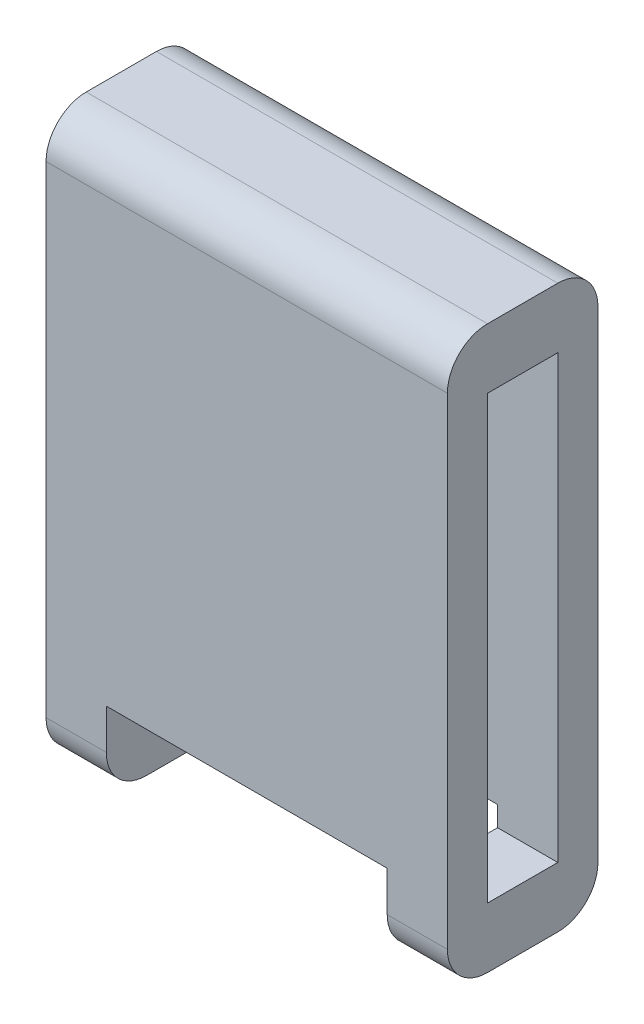
ISO-10303-21;
HEADER;
FILE_DESCRIPTION(('STEP AP214'),'2;1');
FILE_NAME('part.step','',(''),(''),'','','');
FILE_SCHEMA(('AUTOMOTIVE_DESIGN { 1 0 10303 214 1 1 1 1 }'));
ENDSEC;
DATA;
#1=APPLICATION_CONTEXT('core data for automotive mechanical design processes');
#2=APPLICATION_PROTOCOL_DEFINITION('international standard','automotive_design',2000,#1);
#3=PRODUCT_CONTEXT('',#1,'mechanical');
#4=PRODUCT('Part','Part','',(#3));
#5=PRODUCT_RELATED_PRODUCT_CATEGORY('part','',(#4));
#6=PRODUCT_DEFINITION_FORMATION('','',#4);
#7=PRODUCT_DEFINITION_CONTEXT('part definition',#1,'design');
#8=PRODUCT_DEFINITION('design','',#6,#7);
#9=PRODUCT_DEFINITION_SHAPE('','',#8);
#10=(LENGTH_UNIT() NAMED_UNIT(*) SI_UNIT(.MILLI.,.METRE.));
#11=(NAMED_UNIT(*) PLANE_ANGLE_UNIT() SI_UNIT($,.RADIAN.));
#12=(NAMED_UNIT(*) SI_UNIT($,.STERADIAN.) SOLID_ANGLE_UNIT());
#13=UNCERTAINTY_MEASURE_WITH_UNIT(LENGTH_MEASURE(1.E-05),#10,'distance_accuracy_value','');
#14=(GEOMETRIC_REPRESENTATION_CONTEXT(3) GLOBAL_UNCERTAINTY_ASSIGNED_CONTEXT((#13)) GLOBAL_UNIT_ASSIGNED_CONTEXT((#10,
#11,#12)) REPRESENTATION_CONTEXT('',''));
#15=CARTESIAN_POINT('',(0.,0.,0.));
#16=DIRECTION('',(0.,0.,1.));
#17=DIRECTION('',(1.,0.,0.));
#18=AXIS2_PLACEMENT_3D('',#15,#16,#17);
#19=CARTESIAN_POINT('',(-10.,-14.,-15.2547920021456));
#20=DIRECTION('',(0.,1.,0.));
#21=DIRECTION('',(-1.,0.,0.));
#22=AXIS2_PLACEMENT_3D('',#19,#20,#21);
#23=PLANE('',#22);
#24=DIRECTION('',(-1.,0.,0.));
#25=VECTOR('',#24,1.);
#26=CARTESIAN_POINT('',(10.,-14.,-13.2547920021456));
#27=LINE('',#26,#25);
#28=CARTESIAN_POINT('',(-10.,-14.,-13.2547920021456));
#29=VERTEX_POINT('',#28);
#30=CARTESIAN_POINT('',(-7.,-14.,-13.2547920021456));
#31=VERTEX_POINT('',#30);
#32=EDGE_CURVE('E313',#29,#31,#27,.F.);
#33=ORIENTED_EDGE('',*,*,#32,.T.);
#34=DIRECTION('',(0.,0.,1.));
#35=VECTOR('',#34,1.);
#36=CARTESIAN_POINT('',(-7.,-14.,-17.7547920021456));
#37=LINE('',#36,#35);
#38=CARTESIAN_POINT('',(-7.,-14.,-9.75479200214557));
#39=VERTEX_POINT('',#38);
#40=EDGE_CURVE('E203',#31,#39,#37,.T.);
#41=ORIENTED_EDGE('',*,*,#40,.T.);
#42=DIRECTION('',(-1.,0.,0.));
#43=VECTOR('',#42,1.);
#44=CARTESIAN_POINT('',(-10.,-14.,-9.75479200214557));
#45=LINE('',#44,#43);
#46=CARTESIAN_POINT('',(-10.,-14.,-9.75479200214557));
#47=VERTEX_POINT('',#46);
#48=EDGE_CURVE('E308',#39,#47,#45,.T.);
#49=ORIENTED_EDGE('',*,*,#48,.T.);
#50=DIRECTION('',(0.,0.,1.));
#51=VECTOR('',#50,1.);
#52=CARTESIAN_POINT('',(-10.,-14.,-15.2547920021456));
#53=LINE('',#52,#51);
#54=EDGE_CURVE('E275',#29,#47,#53,.T.);
#55=ORIENTED_EDGE('',*,*,#54,.F.);
#56=EDGE_LOOP('',(#33,#41,#49,#55));
#57=FACE_BOUND('',#56,.T.);
#58=ADVANCED_FACE('F33',(#57),#23,.F.);
#59=CARTESIAN_POINT('',(0.,-12.,-13.2547920021456));
#60=DIRECTION('',(1.,0.,0.));
#61=DIRECTION('',(0.,1.,0.));
#62=AXIS2_PLACEMENT_3D('',#59,#60,#61);
#63=CYLINDRICAL_SURFACE('',#62,2.);
#64=CARTESIAN_POINT('',(-7.,-12.,-13.2547920021456));
#65=DIRECTION('',(-1.,0.,0.));
#66=DIRECTION('',(0.,-1.,0.));
#67=AXIS2_PLACEMENT_3D('',#64,#65,#66);
#68=CIRCLE('',#67,2.);
#69=CARTESIAN_POINT('',(-7.,-12.,-15.2547920021456));
#70=VERTEX_POINT('',#69);
#71=EDGE_CURVE('E232',#31,#70,#68,.F.);
#72=ORIENTED_EDGE('',*,*,#71,.F.);
#73=ORIENTED_EDGE('',*,*,#32,.F.);
#74=CARTESIAN_POINT('',(-10.,-12.,-13.2547920021456));
#75=DIRECTION('',(1.,0.,0.));
#76=DIRECTION('',(0.,0.,-1.));
#77=AXIS2_PLACEMENT_3D('',#74,#75,#76);
#78=CIRCLE('',#77,2.);
#79=CARTESIAN_POINT('',(-10.,-12.,-15.2547920021456));
#80=VERTEX_POINT('',#79);
#81=EDGE_CURVE('E306',#80,#29,#78,.F.);
#82=ORIENTED_EDGE('',*,*,#81,.F.);
#83=DIRECTION('',(-1.,0.,0.));
#84=VECTOR('',#83,1.);
#85=CARTESIAN_POINT('',(-10.,-12.,-15.2547920021456));
#86=LINE('',#85,#84);
#87=EDGE_CURVE('E295',#70,#80,#86,.T.);
#88=ORIENTED_EDGE('',*,*,#87,.F.);
#89=EDGE_LOOP('',(#72,#73,#82,#88));
#90=FACE_BOUND('',#89,.T.);
#91=ADVANCED_FACE('F359',(#90),#63,.T.);
#92=CARTESIAN_POINT('',(-10.,-12.,-9.75479200214557));
#93=DIRECTION('',(-1.,0.,0.));
#94=DIRECTION('',(0.,-1.,0.));
#95=AXIS2_PLACEMENT_3D('',#92,#93,#94);
#96=CYLINDRICAL_SURFACE('',#95,2.);
#97=CARTESIAN_POINT('',(-7.,-12.,-9.75479200214557));
#98=DIRECTION('',(-1.,0.,0.));
#99=DIRECTION('',(0.,-1.,0.));
#100=AXIS2_PLACEMENT_3D('',#97,#98,#99);
#101=CIRCLE('',#100,2.);
#102=CARTESIAN_POINT('',(-7.,-12.,-7.75479200214557));
#103=VERTEX_POINT('',#102);
#104=EDGE_CURVE('E230',#103,#39,#101,.F.);
#105=ORIENTED_EDGE('',*,*,#104,.F.);
#106=DIRECTION('',(-1.,0.,0.));
#107=VECTOR('',#106,1.);
#108=CARTESIAN_POINT('',(0.,-12.,-7.75479200214557));
#109=LINE('',#108,#107);
#110=CARTESIAN_POINT('',(-10.,-12.,-7.75479200214557));
#111=VERTEX_POINT('',#110);
#112=EDGE_CURVE('E334',#111,#103,#109,.F.);
#113=ORIENTED_EDGE('',*,*,#112,.F.);
#114=CARTESIAN_POINT('',(-10.,-12.,-9.75479200214557));
#115=DIRECTION('',(1.,0.,0.));
#116=DIRECTION('',(0.,0.,-1.));
#117=AXIS2_PLACEMENT_3D('',#114,#115,#116);
#118=CIRCLE('',#117,2.);
#119=EDGE_CURVE('E299',#47,#111,#118,.F.);
#120=ORIENTED_EDGE('',*,*,#119,.F.);
#121=ORIENTED_EDGE('',*,*,#48,.F.);
#122=EDGE_LOOP('',(#105,#113,#120,#121));
#123=FACE_BOUND('',#122,.T.);
#124=ADVANCED_FACE('F405',(#123),#96,.T.);
#125=CARTESIAN_POINT('',(32.2766694099455,-11.,-9.75479200214557));
#126=DIRECTION('',(0.,-1.,0.));
#127=DIRECTION('',(0.,0.,-1.));
#128=AXIS2_PLACEMENT_3D('',#125,#126,#127);
#129=PLANE('',#128);
#130=DIRECTION('',(-1.,0.,0.));
#131=VECTOR('',#130,1.);
#132=CARTESIAN_POINT('',(32.2766694099455,-11.,-9.75479200214557));
#133=LINE('',#132,#131);
#134=CARTESIAN_POINT('',(-7.,-11.,-9.75479200214557));
#135=VERTEX_POINT('',#134);
#136=CARTESIAN_POINT('',(-10.,-11.,-9.75479200214557));
#137=VERTEX_POINT('',#136);
#138=EDGE_CURVE('E259',#135,#137,#133,.T.);
#139=ORIENTED_EDGE('',*,*,#138,.F.);
#140=DIRECTION('',(0.,0.,-1.));
#141=VECTOR('',#140,1.);
#142=CARTESIAN_POINT('',(-7.,-11.,-9.75479200214557));
#143=LINE('',#142,#141);
#144=CARTESIAN_POINT('',(-7.,-11.,-13.2547920021456));
#145=VERTEX_POINT('',#144);
#146=EDGE_CURVE('E224',#135,#145,#143,.T.);
#147=ORIENTED_EDGE('',*,*,#146,.T.);
#148=DIRECTION('',(-1.,0.,0.));
#149=VECTOR('',#148,1.);
#150=CARTESIAN_POINT('',(32.2766694099455,-11.,-13.2547920021456));
#151=LINE('',#150,#149);
#152=CARTESIAN_POINT('',(-10.,-11.,-13.2547920021456));
#153=VERTEX_POINT('',#152);
#154=EDGE_CURVE('E263',#145,#153,#151,.T.);
#155=ORIENTED_EDGE('',*,*,#154,.T.);
#156=DIRECTION('',(0.,0.,1.));
#157=VECTOR('',#156,1.);
#158=CARTESIAN_POINT('',(-10.,-11.,-9.75479200214557));
#159=LINE('',#158,#157);
#160=EDGE_CURVE('E253',#153,#137,#159,.T.);
#161=ORIENTED_EDGE('',*,*,#160,.T.);
#162=EDGE_LOOP('',(#139,#147,#155,#161));
#163=FACE_BOUND('',#162,.T.);
#164=ADVANCED_FACE('F429',(#163),#129,.F.);
#165=CARTESIAN_POINT('',(0.,0.,-7.75479200214557));
#166=DIRECTION('',(0.,0.,-1.));
#167=DIRECTION('',(-1.,0.,0.));
#168=AXIS2_PLACEMENT_3D('',#165,#166,#167);
#169=PLANE('',#168);
#170=ORIENTED_EDGE('',*,*,#112,.T.);
#171=DIRECTION('',(0.,-1.,0.));
#172=VECTOR('',#171,1.);
#173=CARTESIAN_POINT('',(-7.,-14.,-7.75479200214557));
#174=LINE('',#173,#172);
#175=CARTESIAN_POINT('',(-7.,-10.,-7.75479200214557));
#176=VERTEX_POINT('',#175);
#177=EDGE_CURVE('E199',#176,#103,#174,.T.);
#178=ORIENTED_EDGE('',*,*,#177,.F.);
#179=DIRECTION('',(-1.,0.,0.));
#180=VECTOR('',#179,1.);
#181=CARTESIAN_POINT('',(-7.,-10.,-7.75479200214557));
#182=LINE('',#181,#180);
#183=CARTESIAN_POINT('',(7.,-10.,-7.75479200214557));
#184=VERTEX_POINT('',#183);
#185=EDGE_CURVE('E186',#184,#176,#182,.T.);
#186=ORIENTED_EDGE('',*,*,#185,.F.);
#187=DIRECTION('',(0.,1.,0.));
#188=VECTOR('',#187,1.);
#189=CARTESIAN_POINT('',(7.,-14.,-7.75479200214557));
#190=LINE('',#189,#188);
#191=CARTESIAN_POINT('',(7.,-12.,-7.75479200214557));
#192=VERTEX_POINT('',#191);
#193=EDGE_CURVE('E194',#192,#184,#190,.T.);
#194=ORIENTED_EDGE('',*,*,#193,.F.);
#195=CARTESIAN_POINT('',(10.,-12.,-7.75479200214557));
#196=VERTEX_POINT('',#195);
#197=EDGE_CURVE('E333',#192,#196,#109,.F.);
#198=ORIENTED_EDGE('',*,*,#197,.T.);
#199=DIRECTION('',(0.,-1.,0.));
#200=VECTOR('',#199,1.);
#201=CARTESIAN_POINT('',(10.,-14.,-7.75479200214557));
#202=LINE('',#201,#200);
#203=CARTESIAN_POINT('',(10.,12.,-7.75479200214557));
#204=VERTEX_POINT('',#203);
#205=EDGE_CURVE('E279',#204,#196,#202,.T.);
#206=ORIENTED_EDGE('',*,*,#205,.F.);
#207=DIRECTION('',(1.,0.,0.));
#208=VECTOR('',#207,1.);
#209=CARTESIAN_POINT('',(0.,12.,-7.75479200214557));
#210=LINE('',#209,#208);
#211=CARTESIAN_POINT('',(-10.,12.,-7.75479200214557));
#212=VERTEX_POINT('',#211);
#213=EDGE_CURVE('E330',#204,#212,#210,.F.);
#214=ORIENTED_EDGE('',*,*,#213,.T.);
#215=DIRECTION('',(0.,1.,0.));
#216=VECTOR('',#215,1.);
#217=CARTESIAN_POINT('',(-10.,-14.,-7.75479200214557));
#218=LINE('',#217,#216);
#219=EDGE_CURVE('E276',#111,#212,#218,.T.);
#220=ORIENTED_EDGE('',*,*,#219,.F.);
#221=EDGE_LOOP('',(#170,#178,#186,#194,#198,#206,#214,#220));
#222=FACE_BOUND('',#221,.T.);
#223=ADVANCED_FACE('F202',(#222),#169,.F.);
#224=CARTESIAN_POINT('',(-10.,-14.,-15.2547920021456));
#225=DIRECTION('',(1.,0.,0.));
#226=DIRECTION('',(0.,0.,-1.));
#227=AXIS2_PLACEMENT_3D('',#224,#225,#226);
#228=PLANE('',#227);
#229=DIRECTION('',(0.,0.,-1.));
#230=VECTOR('',#229,1.);
#231=CARTESIAN_POINT('',(-10.,11.,-9.75479200214557));
#232=LINE('',#231,#230);
#233=CARTESIAN_POINT('',(-10.,11.,-9.75479200214557));
#234=VERTEX_POINT('',#233);
#235=CARTESIAN_POINT('',(-10.,11.,-13.2547920021456));
#236=VERTEX_POINT('',#235);
#237=EDGE_CURVE('E247',#234,#236,#232,.T.);
#238=ORIENTED_EDGE('',*,*,#237,.F.);
#239=DIRECTION('',(0.,1.,0.));
#240=VECTOR('',#239,1.);
#241=CARTESIAN_POINT('',(-10.,11.,-9.75479200214557));
#242=LINE('',#241,#240);
#243=EDGE_CURVE('E236',#137,#234,#242,.T.);
#244=ORIENTED_EDGE('',*,*,#243,.F.);
#245=ORIENTED_EDGE('',*,*,#160,.F.);
#246=DIRECTION('',(0.,-1.,0.));
#247=VECTOR('',#246,1.);
#248=CARTESIAN_POINT('',(-10.,11.,-13.2547920021456));
#249=LINE('',#248,#247);
#250=EDGE_CURVE('E250',#236,#153,#249,.T.);
#251=ORIENTED_EDGE('',*,*,#250,.F.);
#252=EDGE_LOOP('',(#238,#244,#245,#251));
#253=FACE_BOUND('',#252,.T.);
#254=DIRECTION('',(0.,1.,0.));
#255=VECTOR('',#254,1.);
#256=CARTESIAN_POINT('',(-10.,-14.,-15.2547920021456));
#257=LINE('',#256,#255);
#258=CARTESIAN_POINT('',(-10.,12.,-15.2547920021456));
#259=VERTEX_POINT('',#258);
#260=EDGE_CURVE('E269',#80,#259,#257,.T.);
#261=ORIENTED_EDGE('',*,*,#260,.F.);
#262=ORIENTED_EDGE('',*,*,#81,.T.);
#263=ORIENTED_EDGE('',*,*,#54,.T.);
#264=ORIENTED_EDGE('',*,*,#119,.T.);
#265=ORIENTED_EDGE('',*,*,#219,.T.);
#266=CARTESIAN_POINT('',(-10.,12.,-9.75479200214557));
#267=DIRECTION('',(1.,0.,0.));
#268=DIRECTION('',(0.,0.,-1.));
#269=AXIS2_PLACEMENT_3D('',#266,#267,#268);
#270=CIRCLE('',#269,2.);
#271=CARTESIAN_POINT('',(-10.,14.,-9.75479200214557));
#272=VERTEX_POINT('',#271);
#273=EDGE_CURVE('E302',#212,#272,#270,.F.);
#274=ORIENTED_EDGE('',*,*,#273,.T.);
#275=DIRECTION('',(0.,0.,1.));
#276=VECTOR('',#275,1.);
#277=CARTESIAN_POINT('',(-10.,14.,-15.2547920021456));
#278=LINE('',#277,#276);
#279=CARTESIAN_POINT('',(-10.,14.,-13.2547920021456));
#280=VERTEX_POINT('',#279);
#281=EDGE_CURVE('E282',#280,#272,#278,.T.);
#282=ORIENTED_EDGE('',*,*,#281,.F.);
#283=CARTESIAN_POINT('',(-10.,12.,-13.2547920021456));
#284=DIRECTION('',(1.,0.,0.));
#285=DIRECTION('',(0.,0.,-1.));
#286=AXIS2_PLACEMENT_3D('',#283,#284,#285);
#287=CIRCLE('',#286,2.);
#288=EDGE_CURVE('E304',#280,#259,#287,.F.);
#289=ORIENTED_EDGE('',*,*,#288,.T.);
#290=EDGE_LOOP('',(#261,#262,#263,#264,#265,#274,#282,#289));
#291=FACE_BOUND('',#290,.T.);
#292=ADVANCED_FACE('F364',(#253,#291),#228,.F.);
#293=CARTESIAN_POINT('',(-10.,14.,-15.2547920021456));
#294=DIRECTION('',(0.,-1.,0.));
#295=DIRECTION('',(1.,0.,0.));
#296=AXIS2_PLACEMENT_3D('',#293,#294,#295);
#297=PLANE('',#296);
#298=DIRECTION('',(0.,0.,1.));
#299=VECTOR('',#298,1.);
#300=CARTESIAN_POINT('',(10.,14.,-15.2547920021456));
#301=LINE('',#300,#299);
#302=CARTESIAN_POINT('',(10.,14.,-13.2547920021456));
#303=VERTEX_POINT('',#302);
#304=CARTESIAN_POINT('',(10.,14.,-9.75479200214557));
#305=VERTEX_POINT('',#304);
#306=EDGE_CURVE('E288',#303,#305,#301,.T.);
#307=ORIENTED_EDGE('',*,*,#306,.F.);
#308=DIRECTION('',(1.,0.,0.));
#309=VECTOR('',#308,1.);
#310=CARTESIAN_POINT('',(-10.,14.,-13.2547920021456));
#311=LINE('',#310,#309);
#312=EDGE_CURVE('E328',#303,#280,#311,.F.);
#313=ORIENTED_EDGE('',*,*,#312,.T.);
#314=ORIENTED_EDGE('',*,*,#281,.T.);
#315=DIRECTION('',(1.,0.,0.));
#316=VECTOR('',#315,1.);
#317=CARTESIAN_POINT('',(-10.,14.,-9.75479200214557));
#318=LINE('',#317,#316);
#319=EDGE_CURVE('E325',#272,#305,#318,.T.);
#320=ORIENTED_EDGE('',*,*,#319,.T.);
#321=EDGE_LOOP('',(#307,#313,#314,#320));
#322=FACE_BOUND('',#321,.T.);
#323=ADVANCED_FACE('F377',(#322),#297,.F.);
#324=CARTESIAN_POINT('',(10.,-14.,-15.2547920021456));
#325=DIRECTION('',(-1.,0.,0.));
#326=DIRECTION('',(0.,0.,1.));
#327=AXIS2_PLACEMENT_3D('',#324,#325,#326);
#328=PLANE('',#327);
#329=DIRECTION('',(0.,0.,-1.));
#330=VECTOR('',#329,1.);
#331=CARTESIAN_POINT('',(10.,-11.,-9.75479200214557));
#332=LINE('',#331,#330);
#333=CARTESIAN_POINT('',(10.,-11.,-9.75479200214557));
#334=VERTEX_POINT('',#333);
#335=CARTESIAN_POINT('',(10.,-11.,-13.2547920021456));
#336=VERTEX_POINT('',#335);
#337=EDGE_CURVE('E240',#334,#336,#332,.T.);
#338=ORIENTED_EDGE('',*,*,#337,.F.);
#339=DIRECTION('',(0.,-1.,0.));
#340=VECTOR('',#339,1.);
#341=CARTESIAN_POINT('',(10.,11.,-9.75479200214557));
#342=LINE('',#341,#340);
#343=CARTESIAN_POINT('',(10.,11.,-9.75479200214557));
#344=VERTEX_POINT('',#343);
#345=EDGE_CURVE('E243',#344,#334,#342,.T.);
#346=ORIENTED_EDGE('',*,*,#345,.F.);
#347=DIRECTION('',(0.,0.,1.));
#348=VECTOR('',#347,1.);
#349=CARTESIAN_POINT('',(10.,11.,-9.75479200214557));
#350=LINE('',#349,#348);
#351=CARTESIAN_POINT('',(10.,11.,-13.2547920021456));
#352=VERTEX_POINT('',#351);
#353=EDGE_CURVE('E245',#352,#344,#350,.T.);
#354=ORIENTED_EDGE('',*,*,#353,.F.);
#355=DIRECTION('',(0.,1.,0.));
#356=VECTOR('',#355,1.);
#357=CARTESIAN_POINT('',(10.,11.,-13.2547920021456));
#358=LINE('',#357,#356);
#359=EDGE_CURVE('E237',#336,#352,#358,.T.);
#360=ORIENTED_EDGE('',*,*,#359,.F.);
#361=EDGE_LOOP('',(#338,#346,#354,#360));
#362=FACE_BOUND('',#361,.T.);
#363=DIRECTION('',(0.,0.,1.));
#364=VECTOR('',#363,1.);
#365=CARTESIAN_POINT('',(10.,-14.,-15.2547920021456));
#366=LINE('',#365,#364);
#367=CARTESIAN_POINT('',(10.,-14.,-13.2547920021456));
#368=VERTEX_POINT('',#367);
#369=CARTESIAN_POINT('',(10.,-14.,-9.75479200214557));
#370=VERTEX_POINT('',#369);
#371=EDGE_CURVE('E285',#368,#370,#366,.T.);
#372=ORIENTED_EDGE('',*,*,#371,.F.);
#373=CARTESIAN_POINT('',(10.,-12.,-13.2547920021456));
#374=DIRECTION('',(-1.,0.,0.));
#375=DIRECTION('',(0.,0.,1.));
#376=AXIS2_PLACEMENT_3D('',#373,#374,#375);
#377=CIRCLE('',#376,2.);
#378=CARTESIAN_POINT('',(10.,-12.,-15.2547920021456));
#379=VERTEX_POINT('',#378);
#380=EDGE_CURVE('E323',#368,#379,#377,.F.);
#381=ORIENTED_EDGE('',*,*,#380,.T.);
#382=DIRECTION('',(0.,-1.,0.));
#383=VECTOR('',#382,1.);
#384=CARTESIAN_POINT('',(10.,-14.,-15.2547920021456));
#385=LINE('',#384,#383);
#386=CARTESIAN_POINT('',(10.,12.,-15.2547920021456));
#387=VERTEX_POINT('',#386);
#388=EDGE_CURVE('E272',#387,#379,#385,.T.);
#389=ORIENTED_EDGE('',*,*,#388,.F.);
#390=CARTESIAN_POINT('',(10.,12.,-13.2547920021456));
#391=DIRECTION('',(-1.,0.,0.));
#392=DIRECTION('',(0.,0.,1.));
#393=AXIS2_PLACEMENT_3D('',#390,#391,#392);
#394=CIRCLE('',#393,2.);
#395=EDGE_CURVE('E321',#387,#303,#394,.F.);
#396=ORIENTED_EDGE('',*,*,#395,.T.);
#397=ORIENTED_EDGE('',*,*,#306,.T.);
#398=CARTESIAN_POINT('',(10.,12.,-9.75479200214557));
#399=DIRECTION('',(-1.,0.,0.));
#400=DIRECTION('',(0.,0.,1.));
#401=AXIS2_PLACEMENT_3D('',#398,#399,#400);
#402=CIRCLE('',#401,2.);
#403=EDGE_CURVE('E318',#305,#204,#402,.F.);
#404=ORIENTED_EDGE('',*,*,#403,.T.);
#405=ORIENTED_EDGE('',*,*,#205,.T.);
#406=CARTESIAN_POINT('',(10.,-12.,-9.75479200214557));
#407=DIRECTION('',(-1.,0.,0.));
#408=DIRECTION('',(0.,0.,1.));
#409=AXIS2_PLACEMENT_3D('',#406,#407,#408);
#410=CIRCLE('',#409,2.);
#411=EDGE_CURVE('E316',#196,#370,#410,.F.);
#412=ORIENTED_EDGE('',*,*,#411,.T.);
#413=EDGE_LOOP('',(#372,#381,#389,#396,#397,#404,#405,#412));
#414=FACE_BOUND('',#413,.T.);
#415=ADVANCED_FACE('F375',(#362,#414),#328,.F.);
#416=CARTESIAN_POINT('',(7.,-14.,-9.75479200214557));
#417=VERTEX_POINT('',#416);
#418=EDGE_CURVE('E309',#370,#417,#45,.T.);
#419=ORIENTED_EDGE('',*,*,#418,.T.);
#420=DIRECTION('',(0.,0.,1.));
#421=VECTOR('',#420,1.);
#422=CARTESIAN_POINT('',(7.,-14.,-17.7547920021456));
#423=LINE('',#422,#421);
#424=CARTESIAN_POINT('',(7.,-14.,-13.2547920021456));
#425=VERTEX_POINT('',#424);
#426=EDGE_CURVE('E48',#425,#417,#423,.T.);
#427=ORIENTED_EDGE('',*,*,#426,.F.);
#428=EDGE_CURVE('E312',#425,#368,#27,.F.);
#429=ORIENTED_EDGE('',*,*,#428,.T.);
#430=ORIENTED_EDGE('',*,*,#371,.T.);
#431=EDGE_LOOP('',(#419,#427,#429,#430));
#432=FACE_BOUND('',#431,.T.);
#433=ADVANCED_FACE('F387',(#432),#23,.F.);
#434=CARTESIAN_POINT('',(0.,0.,-15.2547920021456));
#435=DIRECTION('',(0.,0.,-1.));
#436=DIRECTION('',(-1.,0.,0.));
#437=AXIS2_PLACEMENT_3D('',#434,#435,#436);
#438=PLANE('',#437);
#439=DIRECTION('',(0.,1.,0.));
#440=VECTOR('',#439,1.);
#441=CARTESIAN_POINT('',(-7.,0.,-15.2547920021456));
#442=LINE('',#441,#440);
#443=CARTESIAN_POINT('',(-7.,-10.,-15.2547920021456));
#444=VERTEX_POINT('',#443);
#445=EDGE_CURVE('E234',#70,#444,#442,.T.);
#446=ORIENTED_EDGE('',*,*,#445,.F.);
#447=ORIENTED_EDGE('',*,*,#87,.T.);
#448=ORIENTED_EDGE('',*,*,#260,.T.);
#449=DIRECTION('',(1.,0.,0.));
#450=VECTOR('',#449,1.);
#451=CARTESIAN_POINT('',(10.,12.,-15.2547920021456));
#452=LINE('',#451,#450);
#453=EDGE_CURVE('E278',#259,#387,#452,.T.);
#454=ORIENTED_EDGE('',*,*,#453,.T.);
#455=ORIENTED_EDGE('',*,*,#388,.T.);
#456=CARTESIAN_POINT('',(7.,-12.,-15.2547920021456));
#457=VERTEX_POINT('',#456);
#458=EDGE_CURVE('E296',#379,#457,#86,.T.);
#459=ORIENTED_EDGE('',*,*,#458,.T.);
#460=DIRECTION('',(0.,-1.,0.));
#461=VECTOR('',#460,1.);
#462=CARTESIAN_POINT('',(7.,0.,-15.2547920021456));
#463=LINE('',#462,#461);
#464=CARTESIAN_POINT('',(7.,-10.,-15.2547920021456));
#465=VERTEX_POINT('',#464);
#466=EDGE_CURVE('E219',#465,#457,#463,.T.);
#467=ORIENTED_EDGE('',*,*,#466,.F.);
#468=DIRECTION('',(1.,0.,0.));
#469=VECTOR('',#468,1.);
#470=CARTESIAN_POINT('',(0.,-10.,-15.2547920021456));
#471=LINE('',#470,#469);
#472=EDGE_CURVE('E222',#444,#465,#471,.T.);
#473=ORIENTED_EDGE('',*,*,#472,.F.);
#474=EDGE_LOOP('',(#446,#447,#448,#454,#455,#459,#467,#473));
#475=FACE_BOUND('',#474,.T.);
#476=ADVANCED_FACE('F355',(#475),#438,.T.);
#477=CARTESIAN_POINT('',(7.,-12.,-13.2547920021456));
#478=DIRECTION('',(1.,0.,0.));
#479=DIRECTION('',(0.,1.,0.));
#480=AXIS2_PLACEMENT_3D('',#477,#478,#479);
#481=CIRCLE('',#480,2.);
#482=EDGE_CURVE('E217',#457,#425,#481,.F.);
#483=ORIENTED_EDGE('',*,*,#482,.F.);
#484=ORIENTED_EDGE('',*,*,#458,.F.);
#485=ORIENTED_EDGE('',*,*,#380,.F.);
#486=ORIENTED_EDGE('',*,*,#428,.F.);
#487=EDGE_LOOP('',(#483,#484,#485,#486));
#488=FACE_BOUND('',#487,.T.);
#489=ADVANCED_FACE('F393',(#488),#63,.T.);
#490=CARTESIAN_POINT('',(0.,12.,-13.2547920021456));
#491=DIRECTION('',(-1.,0.,0.));
#492=DIRECTION('',(0.,-1.,0.));
#493=AXIS2_PLACEMENT_3D('',#490,#491,#492);
#494=CYLINDRICAL_SURFACE('',#493,2.);
#495=ORIENTED_EDGE('',*,*,#288,.F.);
#496=ORIENTED_EDGE('',*,*,#312,.F.);
#497=ORIENTED_EDGE('',*,*,#395,.F.);
#498=ORIENTED_EDGE('',*,*,#453,.F.);
#499=EDGE_LOOP('',(#495,#496,#497,#498));
#500=FACE_BOUND('',#499,.T.);
#501=ADVANCED_FACE('F370',(#500),#494,.T.);
#502=CARTESIAN_POINT('',(-10.,12.,-9.75479200214557));
#503=DIRECTION('',(1.,0.,0.));
#504=DIRECTION('',(0.,1.,0.));
#505=AXIS2_PLACEMENT_3D('',#502,#503,#504);
#506=CYLINDRICAL_SURFACE('',#505,2.);
#507=ORIENTED_EDGE('',*,*,#273,.F.);
#508=ORIENTED_EDGE('',*,*,#213,.F.);
#509=ORIENTED_EDGE('',*,*,#403,.F.);
#510=ORIENTED_EDGE('',*,*,#319,.F.);
#511=EDGE_LOOP('',(#507,#508,#509,#510));
#512=FACE_BOUND('',#511,.T.);
#513=ADVANCED_FACE('F381',(#512),#506,.T.);
#514=CARTESIAN_POINT('',(7.,-12.,-9.75479200214557));
#515=DIRECTION('',(1.,0.,0.));
#516=DIRECTION('',(0.,1.,0.));
#517=AXIS2_PLACEMENT_3D('',#514,#515,#516);
#518=CIRCLE('',#517,2.);
#519=EDGE_CURVE('E196',#417,#192,#518,.F.);
#520=ORIENTED_EDGE('',*,*,#519,.F.);
#521=ORIENTED_EDGE('',*,*,#418,.F.);
#522=ORIENTED_EDGE('',*,*,#411,.F.);
#523=ORIENTED_EDGE('',*,*,#197,.F.);
#524=EDGE_LOOP('',(#520,#521,#522,#523));
#525=FACE_BOUND('',#524,.T.);
#526=ADVANCED_FACE('F35',(#525),#96,.T.);
#527=CARTESIAN_POINT('',(32.2766694099455,11.,-9.75479200214557));
#528=DIRECTION('',(0.,0.,1.));
#529=DIRECTION('',(0.,-1.,0.));
#530=AXIS2_PLACEMENT_3D('',#527,#528,#529);
#531=PLANE('',#530);
#532=DIRECTION('',(-1.,0.,0.));
#533=VECTOR('',#532,1.);
#534=CARTESIAN_POINT('',(32.2766694099455,-10.,-9.75479200214557));
#535=LINE('',#534,#533);
#536=CARTESIAN_POINT('',(7.,-10.,-9.75479200214557));
#537=VERTEX_POINT('',#536);
#538=CARTESIAN_POINT('',(-7.,-10.,-9.75479200214557));
#539=VERTEX_POINT('',#538);
#540=EDGE_CURVE('E189',#537,#539,#535,.T.);
#541=ORIENTED_EDGE('',*,*,#540,.T.);
#542=DIRECTION('',(0.,-1.,0.));
#543=VECTOR('',#542,1.);
#544=CARTESIAN_POINT('',(-6.99999999999999,11.,-9.75479200214557));
#545=LINE('',#544,#543);
#546=EDGE_CURVE('E227',#539,#135,#545,.T.);
#547=ORIENTED_EDGE('',*,*,#546,.T.);
#548=ORIENTED_EDGE('',*,*,#138,.T.);
#549=ORIENTED_EDGE('',*,*,#243,.T.);
#550=DIRECTION('',(-1.,0.,0.));
#551=VECTOR('',#550,1.);
#552=CARTESIAN_POINT('',(32.2766694099455,11.,-9.75479200214557));
#553=LINE('',#552,#551);
#554=EDGE_CURVE('E256',#344,#234,#553,.T.);
#555=ORIENTED_EDGE('',*,*,#554,.F.);
#556=ORIENTED_EDGE('',*,*,#345,.T.);
#557=CARTESIAN_POINT('',(7.,-11.,-9.75479200214557));
#558=VERTEX_POINT('',#557);
#559=EDGE_CURVE('E241',#334,#558,#133,.T.);
#560=ORIENTED_EDGE('',*,*,#559,.T.);
#561=DIRECTION('',(0.,1.,0.));
#562=VECTOR('',#561,1.);
#563=CARTESIAN_POINT('',(6.99999999999999,11.,-9.75479200214557));
#564=LINE('',#563,#562);
#565=EDGE_CURVE('E214',#558,#537,#564,.T.);
#566=ORIENTED_EDGE('',*,*,#565,.T.);
#567=EDGE_LOOP('',(#541,#547,#548,#549,#555,#556,#560,#566));
#568=FACE_BOUND('',#567,.T.);
#569=ADVANCED_FACE('F440',(#568),#531,.F.);
#570=CARTESIAN_POINT('',(7.,-11.,-13.2547920021456));
#571=VERTEX_POINT('',#570);
#572=EDGE_CURVE('E260',#336,#571,#151,.T.);
#573=ORIENTED_EDGE('',*,*,#572,.T.);
#574=DIRECTION('',(0.,0.,1.));
#575=VECTOR('',#574,1.);
#576=CARTESIAN_POINT('',(7.,-11.,-9.75479200214557));
#577=LINE('',#576,#575);
#578=EDGE_CURVE('E55',#571,#558,#577,.T.);
#579=ORIENTED_EDGE('',*,*,#578,.T.);
#580=ORIENTED_EDGE('',*,*,#559,.F.);
#581=ORIENTED_EDGE('',*,*,#337,.T.);
#582=EDGE_LOOP('',(#573,#579,#580,#581));
#583=FACE_BOUND('',#582,.T.);
#584=ADVANCED_FACE('F444',(#583),#129,.F.);
#585=CARTESIAN_POINT('',(32.2766694099455,11.,-13.2547920021456));
#586=DIRECTION('',(0.,0.,-1.));
#587=DIRECTION('',(0.,1.,0.));
#588=AXIS2_PLACEMENT_3D('',#585,#586,#587);
#589=PLANE('',#588);
#590=ORIENTED_EDGE('',*,*,#154,.F.);
#591=DIRECTION('',(0.,1.,0.));
#592=VECTOR('',#591,1.);
#593=CARTESIAN_POINT('',(-6.99999999999999,11.,-13.2547920021456));
#594=LINE('',#593,#592);
#595=CARTESIAN_POINT('',(-7.,-10.,-13.2547920021456));
#596=VERTEX_POINT('',#595);
#597=EDGE_CURVE('E11',#145,#596,#594,.T.);
#598=ORIENTED_EDGE('',*,*,#597,.T.);
#599=DIRECTION('',(1.,0.,0.));
#600=VECTOR('',#599,1.);
#601=CARTESIAN_POINT('',(32.2766694099455,-10.,-13.2547920021456));
#602=LINE('',#601,#600);
#603=CARTESIAN_POINT('',(7.,-10.,-13.2547920021456));
#604=VERTEX_POINT('',#603);
#605=EDGE_CURVE('E41',#596,#604,#602,.T.);
#606=ORIENTED_EDGE('',*,*,#605,.T.);
#607=DIRECTION('',(0.,-1.,0.));
#608=VECTOR('',#607,1.);
#609=CARTESIAN_POINT('',(6.99999999999999,11.,-13.2547920021456));
#610=LINE('',#609,#608);
#611=EDGE_CURVE('E336',#604,#571,#610,.T.);
#612=ORIENTED_EDGE('',*,*,#611,.T.);
#613=ORIENTED_EDGE('',*,*,#572,.F.);
#614=ORIENTED_EDGE('',*,*,#359,.T.);
#615=DIRECTION('',(-1.,0.,0.));
#616=VECTOR('',#615,1.);
#617=CARTESIAN_POINT('',(32.2766694099455,11.,-13.2547920021456));
#618=LINE('',#617,#616);
#619=EDGE_CURVE('E264',#352,#236,#618,.T.);
#620=ORIENTED_EDGE('',*,*,#619,.T.);
#621=ORIENTED_EDGE('',*,*,#250,.T.);
#622=EDGE_LOOP('',(#590,#598,#606,#612,#613,#614,#620,#621));
#623=FACE_BOUND('',#622,.T.);
#624=ADVANCED_FACE('F340',(#623),#589,.F.);
#625=CARTESIAN_POINT('',(32.2766694099455,11.,-9.75479200214557));
#626=DIRECTION('',(0.,1.,0.));
#627=DIRECTION('',(0.,0.,1.));
#628=AXIS2_PLACEMENT_3D('',#625,#626,#627);
#629=PLANE('',#628);
#630=ORIENTED_EDGE('',*,*,#353,.T.);
#631=ORIENTED_EDGE('',*,*,#554,.T.);
#632=ORIENTED_EDGE('',*,*,#237,.T.);
#633=ORIENTED_EDGE('',*,*,#619,.F.);
#634=EDGE_LOOP('',(#630,#631,#632,#633));
#635=FACE_BOUND('',#634,.T.);
#636=ADVANCED_FACE('F435',(#635),#629,.F.);
#637=CARTESIAN_POINT('',(-7.,-14.,-17.7547920021456));
#638=DIRECTION('',(-1.,0.,0.));
#639=DIRECTION('',(0.,-1.,0.));
#640=AXIS2_PLACEMENT_3D('',#637,#638,#639);
#641=PLANE('',#640);
#642=ORIENTED_EDGE('',*,*,#445,.T.);
#643=DIRECTION('',(0.,0.,1.));
#644=VECTOR('',#643,1.);
#645=CARTESIAN_POINT('',(-7.,-10.,-17.7547920021456));
#646=LINE('',#645,#644);
#647=EDGE_CURVE('E210',#444,#596,#646,.T.);
#648=ORIENTED_EDGE('',*,*,#647,.T.);
#649=ORIENTED_EDGE('',*,*,#597,.F.);
#650=ORIENTED_EDGE('',*,*,#146,.F.);
#651=ORIENTED_EDGE('',*,*,#546,.F.);
#652=EDGE_CURVE('E209',#539,#176,#646,.T.);
#653=ORIENTED_EDGE('',*,*,#652,.T.);
#654=ORIENTED_EDGE('',*,*,#177,.T.);
#655=ORIENTED_EDGE('',*,*,#104,.T.);
#656=ORIENTED_EDGE('',*,*,#40,.F.);
#657=ORIENTED_EDGE('',*,*,#71,.T.);
#658=EDGE_LOOP('',(#642,#648,#649,#650,#651,#653,#654,#655,#656,#657));
#659=FACE_BOUND('',#658,.T.);
#660=ADVANCED_FACE('F350',(#659),#641,.F.);
#661=CARTESIAN_POINT('',(-7.,-10.,-17.7547920021456));
#662=DIRECTION('',(0.,1.,0.));
#663=DIRECTION('',(0.,0.,1.));
#664=AXIS2_PLACEMENT_3D('',#661,#662,#663);
#665=PLANE('',#664);
#666=DIRECTION('',(0.,0.,1.));
#667=VECTOR('',#666,1.);
#668=CARTESIAN_POINT('',(7.,-10.,-17.7547920021456));
#669=LINE('',#668,#667);
#670=EDGE_CURVE('E181',#537,#184,#669,.T.);
#671=ORIENTED_EDGE('',*,*,#670,.T.);
#672=ORIENTED_EDGE('',*,*,#185,.T.);
#673=ORIENTED_EDGE('',*,*,#652,.F.);
#674=ORIENTED_EDGE('',*,*,#540,.F.);
#675=EDGE_LOOP('',(#671,#672,#673,#674));
#676=FACE_BOUND('',#675,.T.);
#677=ADVANCED_FACE('F183',(#676),#665,.F.);
#678=ORIENTED_EDGE('',*,*,#472,.T.);
#679=EDGE_CURVE('E191',#465,#604,#669,.T.);
#680=ORIENTED_EDGE('',*,*,#679,.T.);
#681=ORIENTED_EDGE('',*,*,#605,.F.);
#682=ORIENTED_EDGE('',*,*,#647,.F.);
#683=EDGE_LOOP('',(#678,#680,#681,#682));
#684=FACE_BOUND('',#683,.T.);
#685=ADVANCED_FACE('F346',(#684),#665,.F.);
#686=CARTESIAN_POINT('',(7.,-14.,-17.7547920021456));
#687=DIRECTION('',(1.,0.,0.));
#688=DIRECTION('',(0.,1.,0.));
#689=AXIS2_PLACEMENT_3D('',#686,#687,#688);
#690=PLANE('',#689);
#691=ORIENTED_EDGE('',*,*,#466,.T.);
#692=ORIENTED_EDGE('',*,*,#482,.T.);
#693=ORIENTED_EDGE('',*,*,#426,.T.);
#694=ORIENTED_EDGE('',*,*,#519,.T.);
#695=ORIENTED_EDGE('',*,*,#193,.T.);
#696=ORIENTED_EDGE('',*,*,#670,.F.);
#697=ORIENTED_EDGE('',*,*,#565,.F.);
#698=ORIENTED_EDGE('',*,*,#578,.F.);
#699=ORIENTED_EDGE('',*,*,#611,.F.);
#700=ORIENTED_EDGE('',*,*,#679,.F.);
#701=EDGE_LOOP('',(#691,#692,#693,#694,#695,#696,#697,#698,#699,#700));
#702=FACE_BOUND('',#701,.T.);
#703=ADVANCED_FACE('F195',(#702),#690,.F.);
#704=CLOSED_SHELL('',(#58,#91,#124,#164,#223,#292,#323,#415,#433,#476,#489,#501,#513,#526,#569,
#584,#624,#636,#660,#677,#685,#703));
#705=MANIFOLD_SOLID_BREP('B2',#704);
#706=ADVANCED_BREP_SHAPE_REPRESENTATION('',(#18,#705),#14);
#707=SHAPE_DEFINITION_REPRESENTATION(#9,#706);
ENDSEC;
END-ISO-10303-21;
